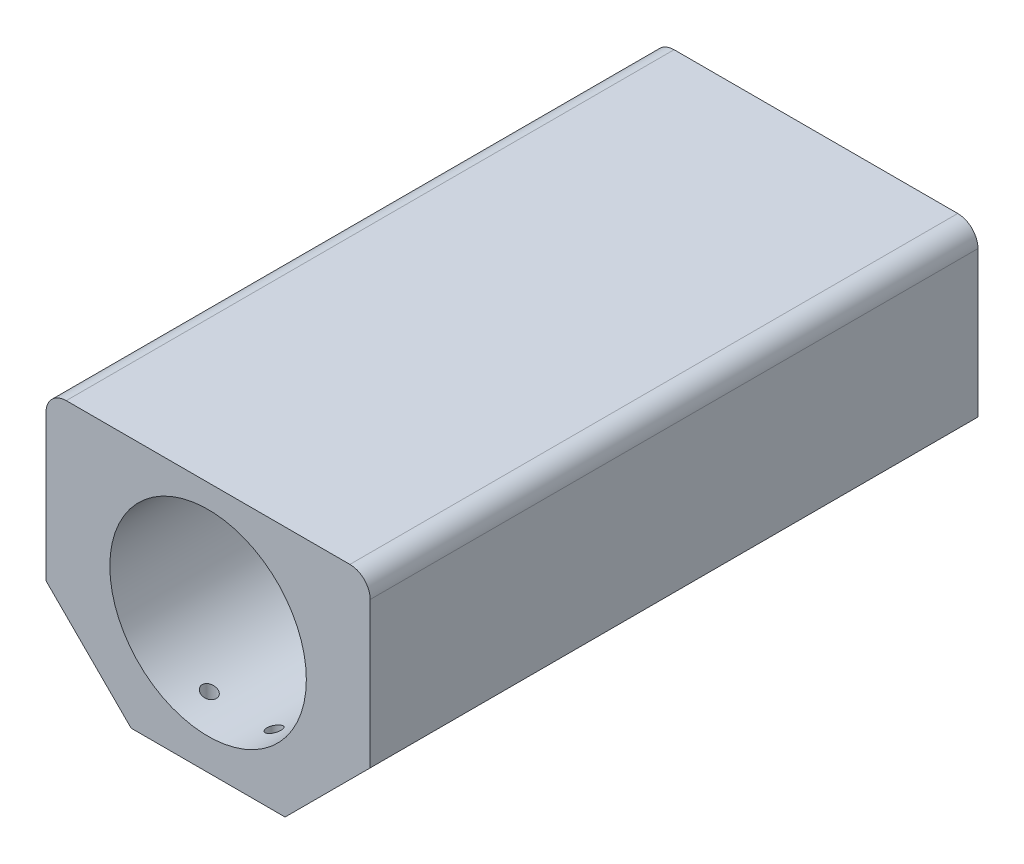
ISO-10303-21;
HEADER;
FILE_DESCRIPTION(('STEP AP214'),'2;1');
FILE_NAME('part.step','',(''),(''),'','','');
FILE_SCHEMA(('AUTOMOTIVE_DESIGN { 1 0 10303 214 1 1 1 1 }'));
ENDSEC;
DATA;
#1=APPLICATION_CONTEXT('core data for automotive mechanical design processes');
#2=APPLICATION_PROTOCOL_DEFINITION('international standard','automotive_design',2000,#1);
#3=PRODUCT_CONTEXT('',#1,'mechanical');
#4=PRODUCT('Part','Part','',(#3));
#5=PRODUCT_RELATED_PRODUCT_CATEGORY('part','',(#4));
#6=PRODUCT_DEFINITION_FORMATION('','',#4);
#7=PRODUCT_DEFINITION_CONTEXT('part definition',#1,'design');
#8=PRODUCT_DEFINITION('design','',#6,#7);
#9=PRODUCT_DEFINITION_SHAPE('','',#8);
#10=(LENGTH_UNIT() NAMED_UNIT(*) SI_UNIT(.MILLI.,.METRE.));
#11=(NAMED_UNIT(*) PLANE_ANGLE_UNIT() SI_UNIT($,.RADIAN.));
#12=(NAMED_UNIT(*) SI_UNIT($,.STERADIAN.) SOLID_ANGLE_UNIT());
#13=UNCERTAINTY_MEASURE_WITH_UNIT(LENGTH_MEASURE(1.E-05),#10,'distance_accuracy_value','');
#14=(GEOMETRIC_REPRESENTATION_CONTEXT(3) GLOBAL_UNCERTAINTY_ASSIGNED_CONTEXT((#13)) GLOBAL_UNIT_ASSIGNED_CONTEXT((#10,
#11,#12)) REPRESENTATION_CONTEXT('',''));
#15=CARTESIAN_POINT('',(0.,0.,0.));
#16=DIRECTION('',(0.,0.,1.));
#17=DIRECTION('',(1.,0.,0.));
#18=AXIS2_PLACEMENT_3D('',#15,#16,#17);
#19=CARTESIAN_POINT('',(0.,0.,150.));
#20=DIRECTION('',(0.,0.,1.));
#21=DIRECTION('',(1.,0.,0.));
#22=AXIS2_PLACEMENT_3D('',#19,#20,#21);
#23=PLANE('',#22);
#24=DIRECTION('',(0.,1.,0.));
#25=VECTOR('',#24,1.);
#26=CARTESIAN_POINT('',(40.,30.,150.));
#27=LINE('',#26,#25);
#28=CARTESIAN_POINT('',(40.,-11.,150.));
#29=VERTEX_POINT('',#28);
#30=CARTESIAN_POINT('',(40.,25.,150.));
#31=VERTEX_POINT('',#30);
#32=EDGE_CURVE('E181',#29,#31,#27,.T.);
#33=ORIENTED_EDGE('',*,*,#32,.T.);
#34=CARTESIAN_POINT('',(35.,25.,150.));
#35=DIRECTION('',(0.,0.,1.));
#36=DIRECTION('',(1.,0.,0.));
#37=AXIS2_PLACEMENT_3D('',#34,#35,#36);
#38=CIRCLE('',#37,5.);
#39=CARTESIAN_POINT('',(35.,30.,150.));
#40=VERTEX_POINT('',#39);
#41=EDGE_CURVE('E53',#31,#40,#38,.T.);
#42=ORIENTED_EDGE('',*,*,#41,.T.);
#43=DIRECTION('',(-1.,0.,0.));
#44=VECTOR('',#43,1.);
#45=CARTESIAN_POINT('',(-40.,30.,150.));
#46=LINE('',#45,#44);
#47=CARTESIAN_POINT('',(-35.,30.,150.));
#48=VERTEX_POINT('',#47);
#49=EDGE_CURVE('E185',#40,#48,#46,.T.);
#50=ORIENTED_EDGE('',*,*,#49,.T.);
#51=CARTESIAN_POINT('',(-35.,25.,150.));
#52=DIRECTION('',(0.,0.,1.));
#53=DIRECTION('',(1.,0.,0.));
#54=AXIS2_PLACEMENT_3D('',#51,#52,#53);
#55=CIRCLE('',#54,5.);
#56=CARTESIAN_POINT('',(-40.,25.,150.));
#57=VERTEX_POINT('',#56);
#58=EDGE_CURVE('E60',#48,#57,#55,.T.);
#59=ORIENTED_EDGE('',*,*,#58,.T.);
#60=DIRECTION('',(0.,-1.,0.));
#61=VECTOR('',#60,1.);
#62=CARTESIAN_POINT('',(-40.,30.,150.));
#63=LINE('',#62,#61);
#64=CARTESIAN_POINT('',(-40.,-11.,150.));
#65=VERTEX_POINT('',#64);
#66=EDGE_CURVE('E178',#57,#65,#63,.T.);
#67=ORIENTED_EDGE('',*,*,#66,.T.);
#68=DIRECTION('',(-0.707106781186548,0.707106781186548,0.));
#69=VECTOR('',#68,1.);
#70=CARTESIAN_POINT('',(-19.,-32.,150.));
#71=LINE('',#70,#69);
#72=CARTESIAN_POINT('',(-19.,-32.,150.));
#73=VERTEX_POINT('',#72);
#74=EDGE_CURVE('E130',#73,#65,#71,.T.);
#75=ORIENTED_EDGE('',*,*,#74,.F.);
#76=DIRECTION('',(-1.,0.,0.));
#77=VECTOR('',#76,1.);
#78=CARTESIAN_POINT('',(-40.,-32.,150.));
#79=LINE('',#78,#77);
#80=CARTESIAN_POINT('',(19.,-32.,150.));
#81=VERTEX_POINT('',#80);
#82=EDGE_CURVE('E167',#81,#73,#79,.T.);
#83=ORIENTED_EDGE('',*,*,#82,.F.);
#84=DIRECTION('',(-0.707106781186548,-0.707106781186548,0.));
#85=VECTOR('',#84,1.);
#86=CARTESIAN_POINT('',(19.,-32.,150.));
#87=LINE('',#86,#85);
#88=EDGE_CURVE('E144',#29,#81,#87,.T.);
#89=ORIENTED_EDGE('',*,*,#88,.F.);
#90=EDGE_LOOP('',(#33,#42,#50,#59,#67,#75,#83,#89));
#91=FACE_BOUND('',#90,.T.);
#92=CARTESIAN_POINT('',(0.,0.,150.));
#93=DIRECTION('',(0.,0.,1.));
#94=DIRECTION('',(1.,0.,0.));
#95=AXIS2_PLACEMENT_3D('',#92,#93,#94);
#96=CIRCLE('',#95,24.25);
#97=CARTESIAN_POINT('',(24.25,0.,150.));
#98=VERTEX_POINT('',#97);
#99=EDGE_CURVE('E122',#98,#98,#96,.T.);
#100=ORIENTED_EDGE('',*,*,#99,.F.);
#101=EDGE_LOOP('',(#100));
#102=FACE_BOUND('',#101,.T.);
#103=ADVANCED_FACE('F44',(#91,#102),#23,.T.);
#104=CARTESIAN_POINT('',(0.,0.,0.));
#105=DIRECTION('',(0.,0.,1.));
#106=DIRECTION('',(1.,0.,0.));
#107=AXIS2_PLACEMENT_3D('',#104,#105,#106);
#108=PLANE('',#107);
#109=DIRECTION('',(-1.,0.,0.));
#110=VECTOR('',#109,1.);
#111=CARTESIAN_POINT('',(-40.,30.,0.));
#112=LINE('',#111,#110);
#113=CARTESIAN_POINT('',(35.,30.,0.));
#114=VERTEX_POINT('',#113);
#115=CARTESIAN_POINT('',(-35.,30.,0.));
#116=VERTEX_POINT('',#115);
#117=EDGE_CURVE('E182',#114,#116,#112,.T.);
#118=ORIENTED_EDGE('',*,*,#117,.F.);
#119=CARTESIAN_POINT('',(35.,25.,0.));
#120=DIRECTION('',(0.,0.,1.));
#121=DIRECTION('',(1.,0.,0.));
#122=AXIS2_PLACEMENT_3D('',#119,#120,#121);
#123=CIRCLE('',#122,5.);
#124=CARTESIAN_POINT('',(40.,25.,0.));
#125=VERTEX_POINT('',#124);
#126=EDGE_CURVE('E211',#114,#125,#123,.F.);
#127=ORIENTED_EDGE('',*,*,#126,.T.);
#128=DIRECTION('',(0.,1.,0.));
#129=VECTOR('',#128,1.);
#130=CARTESIAN_POINT('',(40.,30.,0.));
#131=LINE('',#130,#129);
#132=CARTESIAN_POINT('',(40.,-11.,0.));
#133=VERTEX_POINT('',#132);
#134=EDGE_CURVE('E121',#133,#125,#131,.T.);
#135=ORIENTED_EDGE('',*,*,#134,.F.);
#136=DIRECTION('',(-0.707106781186548,-0.707106781186548,0.));
#137=VECTOR('',#136,1.);
#138=CARTESIAN_POINT('',(19.,-32.,0.));
#139=LINE('',#138,#137);
#140=CARTESIAN_POINT('',(19.,-32.,0.));
#141=VERTEX_POINT('',#140);
#142=EDGE_CURVE('E155',#133,#141,#139,.T.);
#143=ORIENTED_EDGE('',*,*,#142,.T.);
#144=DIRECTION('',(1.,0.,0.));
#145=VECTOR('',#144,1.);
#146=CARTESIAN_POINT('',(-40.,-32.,0.));
#147=LINE('',#146,#145);
#148=CARTESIAN_POINT('',(-19.,-32.,0.));
#149=VERTEX_POINT('',#148);
#150=EDGE_CURVE('E140',#149,#141,#147,.T.);
#151=ORIENTED_EDGE('',*,*,#150,.F.);
#152=DIRECTION('',(-0.707106781186548,0.707106781186548,0.));
#153=VECTOR('',#152,1.);
#154=CARTESIAN_POINT('',(-19.,-32.,0.));
#155=LINE('',#154,#153);
#156=CARTESIAN_POINT('',(-40.,-11.,0.));
#157=VERTEX_POINT('',#156);
#158=EDGE_CURVE('E127',#149,#157,#155,.T.);
#159=ORIENTED_EDGE('',*,*,#158,.T.);
#160=DIRECTION('',(0.,-1.,0.));
#161=VECTOR('',#160,1.);
#162=CARTESIAN_POINT('',(-40.,30.,0.));
#163=LINE('',#162,#161);
#164=CARTESIAN_POINT('',(-40.,25.,0.));
#165=VERTEX_POINT('',#164);
#166=EDGE_CURVE('E113',#165,#157,#163,.T.);
#167=ORIENTED_EDGE('',*,*,#166,.F.);
#168=CARTESIAN_POINT('',(-35.,25.,0.));
#169=DIRECTION('',(0.,0.,1.));
#170=DIRECTION('',(1.,0.,0.));
#171=AXIS2_PLACEMENT_3D('',#168,#169,#170);
#172=CIRCLE('',#171,5.);
#173=EDGE_CURVE('E208',#165,#116,#172,.F.);
#174=ORIENTED_EDGE('',*,*,#173,.T.);
#175=EDGE_LOOP('',(#118,#127,#135,#143,#151,#159,#167,#174));
#176=FACE_BOUND('',#175,.T.);
#177=CARTESIAN_POINT('',(0.,0.,0.));
#178=DIRECTION('',(0.,0.,1.));
#179=DIRECTION('',(1.,0.,0.));
#180=AXIS2_PLACEMENT_3D('',#177,#178,#179);
#181=CIRCLE('',#180,24.25);
#182=CARTESIAN_POINT('',(24.25,0.,0.));
#183=VERTEX_POINT('',#182);
#184=EDGE_CURVE('E171',#183,#183,#181,.T.);
#185=ORIENTED_EDGE('',*,*,#184,.T.);
#186=EDGE_LOOP('',(#185));
#187=FACE_BOUND('',#186,.T.);
#188=ADVANCED_FACE('F136',(#176,#187),#108,.F.);
#189=CARTESIAN_POINT('',(-40.,30.,150.));
#190=DIRECTION('',(1.,0.,0.));
#191=DIRECTION('',(0.,1.,0.));
#192=AXIS2_PLACEMENT_3D('',#189,#190,#191);
#193=PLANE('',#192);
#194=ORIENTED_EDGE('',*,*,#66,.F.);
#195=DIRECTION('',(0.,0.,-1.));
#196=VECTOR('',#195,1.);
#197=CARTESIAN_POINT('',(-40.,25.,150.));
#198=LINE('',#197,#196);
#199=EDGE_CURVE('E11',#57,#165,#198,.T.);
#200=ORIENTED_EDGE('',*,*,#199,.T.);
#201=ORIENTED_EDGE('',*,*,#166,.T.);
#202=DIRECTION('',(0.,0.,1.));
#203=VECTOR('',#202,1.);
#204=CARTESIAN_POINT('',(-40.,-11.,0.));
#205=LINE('',#204,#203);
#206=EDGE_CURVE('E116',#157,#65,#205,.T.);
#207=ORIENTED_EDGE('',*,*,#206,.T.);
#208=EDGE_LOOP('',(#194,#200,#201,#207));
#209=FACE_BOUND('',#208,.T.);
#210=ADVANCED_FACE('F115',(#209),#193,.F.);
#211=CARTESIAN_POINT('',(40.,30.,150.));
#212=DIRECTION('',(-1.,0.,0.));
#213=DIRECTION('',(0.,-1.,0.));
#214=AXIS2_PLACEMENT_3D('',#211,#212,#213);
#215=PLANE('',#214);
#216=ORIENTED_EDGE('',*,*,#134,.T.);
#217=DIRECTION('',(0.,0.,-1.));
#218=VECTOR('',#217,1.);
#219=CARTESIAN_POINT('',(40.,25.,150.));
#220=LINE('',#219,#218);
#221=EDGE_CURVE('E68',#125,#31,#220,.F.);
#222=ORIENTED_EDGE('',*,*,#221,.T.);
#223=ORIENTED_EDGE('',*,*,#32,.F.);
#224=DIRECTION('',(0.,0.,1.));
#225=VECTOR('',#224,1.);
#226=CARTESIAN_POINT('',(40.,-11.,0.));
#227=LINE('',#226,#225);
#228=EDGE_CURVE('E152',#133,#29,#227,.T.);
#229=ORIENTED_EDGE('',*,*,#228,.F.);
#230=EDGE_LOOP('',(#216,#222,#223,#229));
#231=FACE_BOUND('',#230,.T.);
#232=ADVANCED_FACE('F230',(#231),#215,.F.);
#233=CARTESIAN_POINT('',(-40.,30.,150.));
#234=DIRECTION('',(0.,-1.,0.));
#235=DIRECTION('',(0.,0.,-1.));
#236=AXIS2_PLACEMENT_3D('',#233,#234,#235);
#237=PLANE('',#236);
#238=ORIENTED_EDGE('',*,*,#49,.F.);
#239=DIRECTION('',(0.,0.,-1.));
#240=VECTOR('',#239,1.);
#241=CARTESIAN_POINT('',(35.,30.,150.));
#242=LINE('',#241,#240);
#243=EDGE_CURVE('E204',#40,#114,#242,.T.);
#244=ORIENTED_EDGE('',*,*,#243,.T.);
#245=ORIENTED_EDGE('',*,*,#117,.T.);
#246=DIRECTION('',(0.,0.,-1.));
#247=VECTOR('',#246,1.);
#248=CARTESIAN_POINT('',(-35.,30.,150.));
#249=LINE('',#248,#247);
#250=EDGE_CURVE('E187',#116,#48,#249,.F.);
#251=ORIENTED_EDGE('',*,*,#250,.T.);
#252=EDGE_LOOP('',(#238,#244,#245,#251));
#253=FACE_BOUND('',#252,.T.);
#254=ADVANCED_FACE('F225',(#253),#237,.F.);
#255=CARTESIAN_POINT('',(0.,0.,150.));
#256=DIRECTION('',(0.,0.,-1.));
#257=DIRECTION('',(-1.,0.,0.));
#258=AXIS2_PLACEMENT_3D('',#255,#256,#257);
#259=CYLINDRICAL_SURFACE('',#258,24.25);
#260=CARTESIAN_POINT('',(8.,-22.8924114064028,139.95));
#261=CARTESIAN_POINT('',(8.10433357294266,-22.8559497122039,139.950004048093));
#262=CARTESIAN_POINT('',(8.20849993349457,-22.8187398305708,139.959354290502));
#263=CARTESIAN_POINT('',(8.41351732450677,-22.7439482200212,139.996361371671));
#264=CARTESIAN_POINT('',(8.51436302836285,-22.7063660085517,140.024046249468));
#265=CARTESIAN_POINT('',(8.70983515775985,-22.6321054792018,140.097030329321));
#266=CARTESIAN_POINT('',(8.80446215833636,-22.5954270779438,140.142327900068));
#267=CARTESIAN_POINT('',(8.98471937423794,-22.5243581653017,140.249544867665));
#268=CARTESIAN_POINT('',(9.07035255715664,-22.4899669006382,140.311458757682));
#269=CARTESIAN_POINT('',(9.22855320810483,-22.425509824604,140.449405884656));
#270=CARTESIAN_POINT('',(9.30131472320015,-22.3953814530132,140.525186486511));
#271=CARTESIAN_POINT('',(9.43280615585198,-22.3403169867193,140.689731586142));
#272=CARTESIAN_POINT('',(9.49154153184669,-22.315378872653,140.778491011303));
#273=CARTESIAN_POINT('',(9.58901798093833,-22.273658572767,140.960122663761));
#274=CARTESIAN_POINT('',(9.628841197012,-22.2564394302658,141.052312679209));
#275=CARTESIAN_POINT('',(9.69227702253616,-22.2288883845031,141.24307255001));
#276=CARTESIAN_POINT('',(9.7158995902009,-22.2185522505077,141.341638445384));
#277=CARTESIAN_POINT('',(9.74460463460175,-22.2059767556492,141.533983630406));
#278=CARTESIAN_POINT('',(9.75099590925239,-22.2031659420011,141.627532023388));
#279=CARTESIAN_POINT('',(9.74875287045322,-22.2041509954665,141.814402231091));
#280=CARTESIAN_POINT('',(9.74012206573596,-22.2079453198068,141.907724093625));
#281=CARTESIAN_POINT('',(9.7087719824154,-22.2216677928656,142.088211578555));
#282=CARTESIAN_POINT('',(9.68653817866442,-22.2313845342951,142.175478673073));
#283=CARTESIAN_POINT('',(9.62929939834872,-22.2562364260639,142.344887857779));
#284=CARTESIAN_POINT('',(9.59429313091912,-22.2713721240738,142.427029428968));
#285=CARTESIAN_POINT('',(9.51147832140637,-22.3068680671744,142.586721289069));
#286=CARTESIAN_POINT('',(9.46330479116525,-22.3273764367789,142.664048705176));
#287=CARTESIAN_POINT('',(9.3562783264209,-22.372436664399,142.80958362651));
#288=CARTESIAN_POINT('',(9.29742225926787,-22.3969897083181,142.877788446323));
#289=CARTESIAN_POINT('',(9.16609347587616,-22.4510716723443,143.008399752805));
#290=CARTESIAN_POINT('',(9.09294348937171,-22.4808321263877,143.070029129118));
#291=CARTESIAN_POINT('',(8.93830875520039,-22.5427610497888,143.180236529411));
#292=CARTESIAN_POINT('',(8.85682110687321,-22.5749303561317,143.228809989795));
#293=CARTESIAN_POINT('',(8.68144265964171,-22.6429791956146,143.315039532173));
#294=CARTESIAN_POINT('',(8.58708142256231,-22.6789593079087,143.351661838128));
#295=CARTESIAN_POINT('',(8.39358986213065,-22.7512817515768,143.40814229808));
#296=CARTESIAN_POINT('',(8.29445840451636,-22.7876241674543,143.427996443919));
#297=CARTESIAN_POINT('',(8.09047476022871,-22.8608585914563,143.450773252195));
#298=CARTESIAN_POINT('',(7.98554375893454,-22.8977253570515,143.453079370013));
#299=CARTESIAN_POINT('',(7.77632254618258,-22.9696221853958,143.438810139078));
#300=CARTESIAN_POINT('',(7.67203232320481,-23.0046522812506,143.422235130777));
#301=CARTESIAN_POINT('',(7.46857736683953,-23.0715014203267,143.370617668233));
#302=CARTESIAN_POINT('',(7.36936451301181,-23.1033554513875,143.335811265341));
#303=CARTESIAN_POINT('',(7.17791407419914,-23.163551574133,143.24846267085));
#304=CARTESIAN_POINT('',(7.08567483337141,-23.1918945005355,143.195924705796));
#305=CARTESIAN_POINT('',(6.91516497913742,-23.2432914893696,143.076944743072));
#306=CARTESIAN_POINT('',(6.8364661898956,-23.2665196591641,143.011191920608));
#307=CARTESIAN_POINT('',(6.69123000415486,-23.3087037508261,142.866249076813));
#308=CARTESIAN_POINT('',(6.62468926782362,-23.3276608462976,142.787062757241));
#309=CARTESIAN_POINT('',(6.50897210658454,-23.3602063724668,142.62145037331));
#310=CARTESIAN_POINT('',(6.45913879476651,-23.3740013031914,142.535523512995));
#311=CARTESIAN_POINT('',(6.3745718217497,-23.3972064193831,142.355989659054));
#312=CARTESIAN_POINT('',(6.33983510268192,-23.406617492844,142.262384225319));
#313=CARTESIAN_POINT('',(6.28759106581895,-23.4207047544165,142.07343410652));
#314=CARTESIAN_POINT('',(6.26956174003469,-23.4255245397077,141.97824416184));
#315=CARTESIAN_POINT('',(6.24945148047597,-23.4308977309396,141.786078554489));
#316=CARTESIAN_POINT('',(6.24736884711717,-23.4314515915388,141.689103083222));
#317=CARTESIAN_POINT('',(6.2591344726144,-23.4283112634582,141.497629715897));
#318=CARTESIAN_POINT('',(6.2727494580359,-23.4246792785847,141.403116344152));
#319=CARTESIAN_POINT('',(6.31506421379912,-23.4133068755972,141.217791580483));
#320=CARTESIAN_POINT('',(6.34376371705879,-23.4055665302246,141.126980123044));
#321=CARTESIAN_POINT('',(6.41537068477952,-23.386040508657,140.951357957307));
#322=CARTESIAN_POINT('',(6.45831241646701,-23.3742450732684,140.866562326472));
#323=CARTESIAN_POINT('',(6.55696917863561,-23.3467613908113,140.705472672892));
#324=CARTESIAN_POINT('',(6.61268443549079,-23.3310730747522,140.629178800852));
#325=CARTESIAN_POINT('',(6.73628037004879,-23.2956911239622,140.48564822403));
#326=CARTESIAN_POINT('',(6.80437067839834,-23.2759275262963,140.418609485445));
#327=CARTESIAN_POINT('',(6.94987144511878,-23.2328976964795,140.296884682322));
#328=CARTESIAN_POINT('',(7.02728547294057,-23.2096301220229,140.242203371837));
#329=CARTESIAN_POINT('',(7.19199162752182,-23.1591327164015,140.144652575419));
#330=CARTESIAN_POINT('',(7.27953548186719,-23.1317922760151,140.102266397341));
#331=CARTESIAN_POINT('',(7.45954691098953,-23.0743701946236,140.032754765941));
#332=CARTESIAN_POINT('',(7.55200987980757,-23.0442910997834,140.005615302541));
#333=CARTESIAN_POINT('',(7.70414403384928,-22.9937487830554,139.974154520944));
#334=CARTESIAN_POINT('',(7.76308981270969,-22.9739164632307,139.965091566035));
#335=CARTESIAN_POINT('',(7.88137505735382,-22.9336070915143,139.953013149579));
#336=CARTESIAN_POINT('',(7.94071452390019,-22.9131300383735,139.949997699752));
#337=CARTESIAN_POINT('',(8.,-22.8924114064028,139.95));
#338=B_SPLINE_CURVE_WITH_KNOTS('',3,(#260,#261,#262,#263,#264,#265,#266,#267,#268,#269,#270,
#271,#272,#273,#274,#275,#276,#277,#278,#279,#280,#281,#282,#283,#284,#285,#286,#287,#288,#289,
#290,#291,#292,#293,#294,#295,#296,#297,#298,#299,#300,#301,#302,#303,#304,#305,#306,#307,#308,
#309,#310,#311,#312,#313,#314,#315,#316,#317,#318,#319,#320,#321,#322,#323,#324,#325,#326,#327,
#328,#329,#330,#331,#332,#333,#334,#335,#336,#337),.UNSPECIFIED.,.T.,.F.,(4,2,2,2,2,2,2,2,2,2,2,
2,2,2,2,2,2,2,2,2,2,2,2,2,2,2,2,2,2,2,2,2,2,2,2,2,2,2,4),(0.,0.331334293633508,
0.663176468312504,0.994987914665915,1.3266895304967,1.65286044233522,1.97890421328514,
2.28293623024731,2.58678119691185,2.86679545425703,3.14674431697388,3.41724189387494,
3.6877668165254,3.96672278488561,4.24576068953297,4.54499733760949,4.84433844594958,
5.16516388736204,5.48606599521786,5.81819304489709,6.15031410598501,6.47823760263791,
6.80608298966562,7.11993506444173,7.43370079361456,7.73306317872175,8.03236489861098,
8.32196443477272,8.61153310524284,8.89685352146315,9.182168886054,9.4681757691084,
9.75418772120579,10.0455941060896,10.337112408432,10.6388880467573,10.9403859304835,
11.1286596829122,11.3169338001712),.UNSPECIFIED.);
#339=CARTESIAN_POINT('',(8.,-22.8924114064028,139.95));
#340=VERTEX_POINT('',#339);
#341=EDGE_CURVE('E288',#340,#340,#338,.T.);
#342=ORIENTED_EDGE('',*,*,#341,.T.);
#343=EDGE_LOOP('',(#342));
#344=FACE_BOUND('',#343,.T.);
#345=CARTESIAN_POINT('',(8.,-22.8924114064028,109.95));
#346=CARTESIAN_POINT('',(8.10433357294266,-22.8559497122039,109.950004048093));
#347=CARTESIAN_POINT('',(8.20849993349457,-22.8187398305708,109.959354290502));
#348=CARTESIAN_POINT('',(8.41351732450677,-22.7439482200212,109.996361371671));
#349=CARTESIAN_POINT('',(8.51436302836285,-22.7063660085517,110.024046249468));
#350=CARTESIAN_POINT('',(8.70983515775985,-22.6321054792018,110.097030329321));
#351=CARTESIAN_POINT('',(8.80446215833636,-22.5954270779438,110.142327900068));
#352=CARTESIAN_POINT('',(8.98471937423793,-22.5243581653017,110.249544867665));
#353=CARTESIAN_POINT('',(9.07035255715662,-22.4899669006382,110.311458757682));
#354=CARTESIAN_POINT('',(9.22855320810482,-22.425509824604,110.449405884656));
#355=CARTESIAN_POINT('',(9.30131472320016,-22.3953814530132,110.525186486511));
#356=CARTESIAN_POINT('',(9.43280615585199,-22.3403169867193,110.689731586142));
#357=CARTESIAN_POINT('',(9.49154153184669,-22.315378872653,110.778491011303));
#358=CARTESIAN_POINT('',(9.58901798093832,-22.273658572767,110.960122663761));
#359=CARTESIAN_POINT('',(9.628841197012,-22.2564394302658,111.052312679209));
#360=CARTESIAN_POINT('',(9.69227702253617,-22.2288883845031,111.24307255001));
#361=CARTESIAN_POINT('',(9.7158995902009,-22.2185522505077,111.341638445384));
#362=CARTESIAN_POINT('',(9.74460463460175,-22.2059767556492,111.533983630406));
#363=CARTESIAN_POINT('',(9.75099590925239,-22.2031659420011,111.627532023388));
#364=CARTESIAN_POINT('',(9.74875287045322,-22.2041509954665,111.814402231091));
#365=CARTESIAN_POINT('',(9.74012206573597,-22.2079453198068,111.907724093625));
#366=CARTESIAN_POINT('',(9.7087719824154,-22.2216677928656,112.088211578555));
#367=CARTESIAN_POINT('',(9.68653817866441,-22.2313845342951,112.175478673073));
#368=CARTESIAN_POINT('',(9.62929939834872,-22.2562364260639,112.344887857779));
#369=CARTESIAN_POINT('',(9.59429313091912,-22.2713721240738,112.427029428968));
#370=CARTESIAN_POINT('',(9.51147832140638,-22.3068680671744,112.586721289069));
#371=CARTESIAN_POINT('',(9.46330479116526,-22.3273764367789,112.664048705176));
#372=CARTESIAN_POINT('',(9.3562783264209,-22.372436664399,112.80958362651));
#373=CARTESIAN_POINT('',(9.29742225926788,-22.3969897083181,112.877788446323));
#374=CARTESIAN_POINT('',(9.16609347587616,-22.4510716723443,113.008399752805));
#375=CARTESIAN_POINT('',(9.09294348937171,-22.4808321263877,113.070029129118));
#376=CARTESIAN_POINT('',(8.93830875520039,-22.5427610497888,113.180236529411));
#377=CARTESIAN_POINT('',(8.85682110687322,-22.5749303561317,113.228809989795));
#378=CARTESIAN_POINT('',(8.68144265964172,-22.6429791956146,113.315039532173));
#379=CARTESIAN_POINT('',(8.58708142256232,-22.6789593079087,113.351661838128));
#380=CARTESIAN_POINT('',(8.39358986213067,-22.7512817515768,113.40814229808));
#381=CARTESIAN_POINT('',(8.29445840451637,-22.7876241674543,113.427996443919));
#382=CARTESIAN_POINT('',(8.09047476022873,-22.8608585914563,113.450773252195));
#383=CARTESIAN_POINT('',(7.98554375893455,-22.8977253570515,113.453079370013));
#384=CARTESIAN_POINT('',(7.77632254618259,-22.9696221853958,113.438810139078));
#385=CARTESIAN_POINT('',(7.67203232320481,-23.0046522812506,113.422235130777));
#386=CARTESIAN_POINT('',(7.46857736683954,-23.0715014203267,113.370617668233));
#387=CARTESIAN_POINT('',(7.36936451301182,-23.1033554513875,113.335811265341));
#388=CARTESIAN_POINT('',(7.17791407419915,-23.163551574133,113.24846267085));
#389=CARTESIAN_POINT('',(7.08567483337142,-23.1918945005355,113.195924705796));
#390=CARTESIAN_POINT('',(6.91516497913743,-23.2432914893696,113.076944743072));
#391=CARTESIAN_POINT('',(6.83646618989562,-23.2665196591641,113.011191920608));
#392=CARTESIAN_POINT('',(6.69123000415487,-23.3087037508261,112.866249076813));
#393=CARTESIAN_POINT('',(6.62468926782363,-23.3276608462976,112.787062757242));
#394=CARTESIAN_POINT('',(6.50897210658455,-23.3602063724668,112.62145037331));
#395=CARTESIAN_POINT('',(6.45913879476652,-23.3740013031914,112.535523512995));
#396=CARTESIAN_POINT('',(6.37457182174971,-23.3972064193831,112.355989659054));
#397=CARTESIAN_POINT('',(6.33983510268192,-23.406617492844,112.262384225319));
#398=CARTESIAN_POINT('',(6.28759106581895,-23.4207047544165,112.07343410652));
#399=CARTESIAN_POINT('',(6.26956174003469,-23.4255245397077,111.97824416184));
#400=CARTESIAN_POINT('',(6.24945148047597,-23.4308977309396,111.786078554489));
#401=CARTESIAN_POINT('',(6.24736884711717,-23.4314515915388,111.689103083222));
#402=CARTESIAN_POINT('',(6.2591344726144,-23.4283112634582,111.497629715897));
#403=CARTESIAN_POINT('',(6.27274945803589,-23.4246792785847,111.403116344152));
#404=CARTESIAN_POINT('',(6.31506421379911,-23.4133068755972,111.217791580483));
#405=CARTESIAN_POINT('',(6.34376371705879,-23.4055665302246,111.126980123044));
#406=CARTESIAN_POINT('',(6.41537068477952,-23.386040508657,110.951357957307));
#407=CARTESIAN_POINT('',(6.458312416467,-23.3742450732684,110.866562326472));
#408=CARTESIAN_POINT('',(6.55696917863559,-23.3467613908113,110.705472672892));
#409=CARTESIAN_POINT('',(6.61268443549078,-23.3310730747522,110.629178800852));
#410=CARTESIAN_POINT('',(6.73628037004879,-23.2956911239622,110.48564822403));
#411=CARTESIAN_POINT('',(6.80437067839833,-23.2759275262963,110.418609485445));
#412=CARTESIAN_POINT('',(6.94987144511878,-23.2328976964795,110.296884682322));
#413=CARTESIAN_POINT('',(7.02728547294057,-23.2096301220229,110.242203371837));
#414=CARTESIAN_POINT('',(7.19199162752183,-23.1591327164015,110.144652575419));
#415=CARTESIAN_POINT('',(7.2795354818672,-23.1317922760151,110.102266397341));
#416=CARTESIAN_POINT('',(7.45954691098953,-23.0743701946236,110.032754765941));
#417=CARTESIAN_POINT('',(7.55200987980756,-23.0442910997834,110.005615302541));
#418=CARTESIAN_POINT('',(7.70414403384927,-22.9937487830554,109.974154520944));
#419=CARTESIAN_POINT('',(7.76308981270968,-22.9739164632307,109.965091566035));
#420=CARTESIAN_POINT('',(7.88137505735381,-22.9336070915143,109.953013149579));
#421=CARTESIAN_POINT('',(7.94071452390019,-22.9131300383735,109.949997699752));
#422=CARTESIAN_POINT('',(8.,-22.8924114064028,109.95));
#423=B_SPLINE_CURVE_WITH_KNOTS('',3,(#345,#346,#347,#348,#349,#350,#351,#352,#353,#354,#355,
#356,#357,#358,#359,#360,#361,#362,#363,#364,#365,#366,#367,#368,#369,#370,#371,#372,#373,#374,
#375,#376,#377,#378,#379,#380,#381,#382,#383,#384,#385,#386,#387,#388,#389,#390,#391,#392,#393,
#394,#395,#396,#397,#398,#399,#400,#401,#402,#403,#404,#405,#406,#407,#408,#409,#410,#411,#412,
#413,#414,#415,#416,#417,#418,#419,#420,#421,#422),.UNSPECIFIED.,.T.,.F.,(4,2,2,2,2,2,2,2,2,2,2,
2,2,2,2,2,2,2,2,2,2,2,2,2,2,2,2,2,2,2,2,2,2,2,2,2,2,2,4),(0.,0.331334293633509,
0.663176468312498,0.994987914665911,1.32668953049668,1.65286044233523,1.97890421328515,
2.2829362302473,2.58678119691185,2.86679545425701,3.14674431697388,3.41724189387492,
3.68776681652539,3.96672278488558,4.24576068953296,4.54499733760948,4.84433844594957,
5.16516388736202,5.48606599521785,5.81819304489708,6.150314105985,6.4782376026379,
6.80608298966561,7.11993506444172,7.43370079361454,7.73306317872173,8.03236489861098,
8.32196443477273,8.61153310524282,8.89685352146313,9.18216888605399,9.46817576910838,
9.75418772120579,10.0455941060896,10.337112408432,10.6388880467573,10.9403859304835,
11.1286596829122,11.3169338001712),.UNSPECIFIED.);
#424=CARTESIAN_POINT('',(8.,-22.8924114064028,109.95));
#425=VERTEX_POINT('',#424);
#426=EDGE_CURVE('E468',#425,#425,#423,.T.);
#427=ORIENTED_EDGE('',*,*,#426,.T.);
#428=EDGE_LOOP('',(#427));
#429=FACE_BOUND('',#428,.T.);
#430=CARTESIAN_POINT('',(-8.,-22.8924114064028,109.95));
#431=CARTESIAN_POINT('',(-7.89904468974055,-22.9276903647347,109.95000358086));
#432=CARTESIAN_POINT('',(-7.79779105789885,-22.9623186125341,109.958756030023));
#433=CARTESIAN_POINT('',(-7.59753319621065,-23.0293544506875,109.99387290465));
#434=CARTESIAN_POINT('',(-7.49853115126179,-23.0617599408378,110.020253740508));
#435=CARTESIAN_POINT('',(-7.30566547830961,-23.1235814801303,110.090361164229));
#436=CARTESIAN_POINT('',(-7.21180946860057,-23.152993149504,110.134112718838));
#437=CARTESIAN_POINT('',(-7.032510045011,-23.2080827826809,110.23808510236));
#438=CARTESIAN_POINT('',(-6.94706361230767,-23.2337620878972,110.298299991814));
#439=CARTESIAN_POINT('',(-6.79048044672971,-23.2799981445086,110.431249252657));
#440=CARTESIAN_POINT('',(-6.71893863659251,-23.3007062950454,110.503453505208));
#441=CARTESIAN_POINT('',(-6.5890141782852,-23.3377798713555,110.659834185156));
#442=CARTESIAN_POINT('',(-6.53062869045337,-23.354146234396,110.744008022626));
#443=CARTESIAN_POINT('',(-6.43138124857051,-23.3816676817597,110.917994428629));
#444=CARTESIAN_POINT('',(-6.38987266069307,-23.393016917234,111.00740778427));
#445=CARTESIAN_POINT('',(-6.32236699832597,-23.4113521402389,111.19232893542));
#446=CARTESIAN_POINT('',(-6.29636711985784,-23.4183389165139,111.287835625796));
#447=CARTESIAN_POINT('',(-6.26131063985513,-23.4277359396114,111.479372993317));
#448=CARTESIAN_POINT('',(-6.25180375947084,-23.4302678385019,111.575315536938));
#449=CARTESIAN_POINT('',(-6.24866383512068,-23.4311054868388,111.767474814741));
#450=CARTESIAN_POINT('',(-6.25502944897698,-23.4294115936182,111.86369152505));
#451=CARTESIAN_POINT('',(-6.28326800829451,-23.4218540989942,112.052657584771));
#452=CARTESIAN_POINT('',(-6.30498480852082,-23.4160324811138,112.145432029012));
#453=CARTESIAN_POINT('',(-6.36301993314821,-23.4003285039244,112.325925800316));
#454=CARTESIAN_POINT('',(-6.39933826641907,-23.3904461421486,112.413645124308));
#455=CARTESIAN_POINT('',(-6.48566815782207,-23.3666560927545,112.58222938193));
#456=CARTESIAN_POINT('',(-6.53577140894379,-23.3527214137027,112.663043491968));
#457=CARTESIAN_POINT('',(-6.64792970817256,-23.3210402181133,112.815047122687));
#458=CARTESIAN_POINT('',(-6.70998573058937,-23.3032933908215,112.886235857967));
#459=CARTESIAN_POINT('',(-6.84568665015891,-23.2637952920117,113.018812492356));
#460=CARTESIAN_POINT('',(-6.91956805916375,-23.241960285511,113.079933111753));
#461=CARTESIAN_POINT('',(-7.0755562309385,-23.1949484844228,113.18894705122));
#462=CARTESIAN_POINT('',(-7.15766433285432,-23.1697711455509,113.23683821301));
#463=CARTESIAN_POINT('',(-7.33102021571228,-23.1155184267943,113.320049269301));
#464=CARTESIAN_POINT('',(-7.42249769461201,-23.0863306208567,113.354816909585));
#465=CARTESIAN_POINT('',(-7.60918293871443,-23.0254745632835,113.408567934148));
#466=CARTESIAN_POINT('',(-7.70439154123592,-22.9938057532628,113.427547753923));
#467=CARTESIAN_POINT('',(-7.90044060254881,-22.9272050635766,113.450075255474));
#468=CARTESIAN_POINT('',(-8.00133897328999,-22.892190128743,113.452874594152));
#469=CARTESIAN_POINT('',(-8.20177975548268,-22.8211442876638,113.441226547041));
#470=CARTESIAN_POINT('',(-8.30132183955402,-22.7851131423501,113.426775069316));
#471=CARTESIAN_POINT('',(-8.4999759161348,-22.7117703466241,113.380266837295));
#472=CARTESIAN_POINT('',(-8.59894584979034,-22.6744588759562,113.347600346579));
#473=CARTESIAN_POINT('',(-8.78994784768064,-22.6011015952389,113.265026973476));
#474=CARTESIAN_POINT('',(-8.88197900644781,-22.5650559506988,113.215117845756));
#475=CARTESIAN_POINT('',(-9.05635142010267,-22.4956397996347,113.099135945409));
#476=CARTESIAN_POINT('',(-9.13869557843827,-22.4622684925025,113.033068034367));
#477=CARTESIAN_POINT('',(-9.29095397648365,-22.3997200643848,112.886218183095));
#478=CARTESIAN_POINT('',(-9.3608715909556,-22.3705418050777,112.805440249871));
#479=CARTESIAN_POINT('',(-9.48227976056949,-22.319341364241,112.63576558431));
#480=CARTESIAN_POINT('',(-9.53453924026877,-22.2970260479199,112.547509119503));
#481=CARTESIAN_POINT('',(-9.62317928204954,-22.2589143084223,112.362064911915));
#482=CARTESIAN_POINT('',(-9.65956998021862,-22.2431137243526,112.264882918435));
#483=CARTESIAN_POINT('',(-9.71247052504851,-22.2200626350624,112.072887166517));
#484=CARTESIAN_POINT('',(-9.73035498779503,-22.212221944774,111.978522092701));
#485=CARTESIAN_POINT('',(-9.75041862427556,-22.2034223660203,111.787831655887));
#486=CARTESIAN_POINT('',(-9.75260382882926,-22.2024608349488,111.691507059895));
#487=CARTESIAN_POINT('',(-9.74149450655421,-22.2073368595541,111.505260074372));
#488=CARTESIAN_POINT('',(-9.72904151719709,-22.2128047960468,111.415276058878));
#489=CARTESIAN_POINT('',(-9.69055821672479,-22.2296202750329,111.238843481653));
#490=CARTESIAN_POINT('',(-9.66452785643855,-22.2409678388196,111.152394932728));
#491=CARTESIAN_POINT('',(-9.59961725377079,-22.2690615152928,110.984530496352));
#492=CARTESIAN_POINT('',(-9.56062597040759,-22.2858542471446,110.903165579162));
#493=CARTESIAN_POINT('',(-9.47122774709991,-22.3239938144776,110.748159769037));
#494=CARTESIAN_POINT('',(-9.42081852876583,-22.3453415588384,110.674520421997));
#495=CARTESIAN_POINT('',(-9.30668107830385,-22.3931292583252,110.532131488853));
#496=CARTESIAN_POINT('',(-9.24232130104217,-22.4198027104099,110.463967224471));
#497=CARTESIAN_POINT('',(-9.10432371824802,-22.4761950681623,110.339254548201));
#498=CARTESIAN_POINT('',(-9.03068064917817,-22.5059156997529,110.282712774379));
#499=CARTESIAN_POINT('',(-8.87002085181358,-22.5697420967727,110.178344446595));
#500=CARTESIAN_POINT('',(-8.78241023682831,-22.6040092285404,110.13153067867));
#501=CARTESIAN_POINT('',(-8.60099911944124,-22.6736572217706,110.053476543046));
#502=CARTESIAN_POINT('',(-8.50720336401698,-22.70903721847,110.022224386071));
#503=CARTESIAN_POINT('',(-8.34427188339731,-22.769294820406,109.982802444601));
#504=CARTESIAN_POINT('',(-8.27609718797859,-22.7941669320949,109.970532260095));
#505=CARTESIAN_POINT('',(-8.13866201600968,-22.8435990109853,109.95412965523));
#506=CARTESIAN_POINT('',(-8.06940149906545,-22.8681589665122,109.949997538346));
#507=CARTESIAN_POINT('',(-8.,-22.8924114064028,109.95));
#508=B_SPLINE_CURVE_WITH_KNOTS('',3,(#430,#431,#432,#433,#434,#435,#436,#437,#438,#439,#440,
#441,#442,#443,#444,#445,#446,#447,#448,#449,#450,#451,#452,#453,#454,#455,#456,#457,#458,#459,
#460,#461,#462,#463,#464,#465,#466,#467,#468,#469,#470,#471,#472,#473,#474,#475,#476,#477,#478,
#479,#480,#481,#482,#483,#484,#485,#486,#487,#488,#489,#490,#491,#492,#493,#494,#495,#496,#497,
#498,#499,#500,#501,#502,#503,#504,#505,#506,#507),.UNSPECIFIED.,.T.,.F.,(4,2,2,2,2,2,2,2,2,2,2,
2,2,2,2,2,2,2,2,2,2,2,2,2,2,2,2,2,2,2,2,2,2,2,2,2,2,2,4),(0.,0.320570634493434,
0.641440107040775,0.962772441124536,1.28398900114972,1.59361549229499,1.90317508948171,
2.19939695557951,2.49556524844478,2.78351249332211,3.07143539021129,3.35647104081007,
3.64150686455552,3.92848651273003,4.21548956346828,4.50918574810908,4.80292981870071,
5.10793375744777,5.41300653997274,5.73208253784362,6.05123423637918,6.38177283973234,
6.71235450195899,7.04283682637806,7.3732292618344,7.68644796238557,7.99946630229406,
8.28706238110655,8.57454797489724,8.84628293376366,9.11801887673734,9.3921456094188,
9.6663270909306,9.95748996236657,10.2488186692179,10.5626878752834,10.8763189349307,
11.0966862730285,11.3170618286385),.UNSPECIFIED.);
#509=CARTESIAN_POINT('',(-8.,-22.8924114064028,109.95));
#510=VERTEX_POINT('',#509);
#511=EDGE_CURVE('E313',#510,#510,#508,.T.);
#512=ORIENTED_EDGE('',*,*,#511,.T.);
#513=EDGE_LOOP('',(#512));
#514=FACE_BOUND('',#513,.T.);
#515=CARTESIAN_POINT('',(-8.,-22.8924114064028,139.95));
#516=CARTESIAN_POINT('',(-7.89904468974055,-22.9276903647347,139.95000358086));
#517=CARTESIAN_POINT('',(-7.79779105789886,-22.9623186125341,139.958756030023));
#518=CARTESIAN_POINT('',(-7.59753319621065,-23.0293544506875,139.99387290465));
#519=CARTESIAN_POINT('',(-7.4985311512618,-23.0617599408378,140.020253740508));
#520=CARTESIAN_POINT('',(-7.30566547830962,-23.1235814801303,140.090361164229));
#521=CARTESIAN_POINT('',(-7.21180946860058,-23.152993149504,140.134112718838));
#522=CARTESIAN_POINT('',(-7.03251004501101,-23.2080827826808,140.23808510236));
#523=CARTESIAN_POINT('',(-6.94706361230768,-23.2337620878972,140.298299991814));
#524=CARTESIAN_POINT('',(-6.79048044672972,-23.2799981445086,140.431249252657));
#525=CARTESIAN_POINT('',(-6.71893863659252,-23.3007062950454,140.503453505208));
#526=CARTESIAN_POINT('',(-6.58901417828521,-23.3377798713555,140.659834185156));
#527=CARTESIAN_POINT('',(-6.53062869045338,-23.354146234396,140.744008022626));
#528=CARTESIAN_POINT('',(-6.43138124857051,-23.3816676817597,140.917994428629));
#529=CARTESIAN_POINT('',(-6.38987266069307,-23.393016917234,141.007407784269));
#530=CARTESIAN_POINT('',(-6.32236699832598,-23.4113521402389,141.19232893542));
#531=CARTESIAN_POINT('',(-6.29636711985784,-23.4183389165139,141.287835625796));
#532=CARTESIAN_POINT('',(-6.26131063985513,-23.4277359396114,141.479372993317));
#533=CARTESIAN_POINT('',(-6.25180375947084,-23.4302678385019,141.575315536938));
#534=CARTESIAN_POINT('',(-6.24866383512068,-23.4311054868388,141.76747481474));
#535=CARTESIAN_POINT('',(-6.25502944897697,-23.4294115936182,141.86369152505));
#536=CARTESIAN_POINT('',(-6.2832680082945,-23.4218540989942,142.052657584771));
#537=CARTESIAN_POINT('',(-6.30498480852081,-23.4160324811138,142.145432029012));
#538=CARTESIAN_POINT('',(-6.3630199331482,-23.4003285039244,142.325925800316));
#539=CARTESIAN_POINT('',(-6.39933826641906,-23.3904461421486,142.413645124308));
#540=CARTESIAN_POINT('',(-6.48566815782207,-23.3666560927545,142.58222938193));
#541=CARTESIAN_POINT('',(-6.53577140894379,-23.3527214137027,142.663043491968));
#542=CARTESIAN_POINT('',(-6.64792970817255,-23.3210402181133,142.815047122687));
#543=CARTESIAN_POINT('',(-6.70998573058937,-23.3032933908215,142.886235857967));
#544=CARTESIAN_POINT('',(-6.8456866501589,-23.2637952920117,143.018812492356));
#545=CARTESIAN_POINT('',(-6.91956805916375,-23.241960285511,143.079933111753));
#546=CARTESIAN_POINT('',(-7.07555623093849,-23.1949484844228,143.18894705122));
#547=CARTESIAN_POINT('',(-7.15766433285431,-23.1697711455509,143.23683821301));
#548=CARTESIAN_POINT('',(-7.33102021571228,-23.1155184267943,143.320049269301));
#549=CARTESIAN_POINT('',(-7.422497694612,-23.0863306208567,143.354816909585));
#550=CARTESIAN_POINT('',(-7.60918293871443,-23.0254745632835,143.408567934148));
#551=CARTESIAN_POINT('',(-7.70439154123592,-22.9938057532628,143.427547753923));
#552=CARTESIAN_POINT('',(-7.9004406025488,-22.9272050635766,143.450075255474));
#553=CARTESIAN_POINT('',(-8.00133897328998,-22.892190128743,143.452874594152));
#554=CARTESIAN_POINT('',(-8.20177975548267,-22.8211442876638,143.441226547041));
#555=CARTESIAN_POINT('',(-8.30132183955401,-22.7851131423502,143.426775069316));
#556=CARTESIAN_POINT('',(-8.49997591613478,-22.7117703466241,143.380266837295));
#557=CARTESIAN_POINT('',(-8.59894584979033,-22.6744588759562,143.347600346579));
#558=CARTESIAN_POINT('',(-8.78994784768062,-22.6011015952389,143.265026973476));
#559=CARTESIAN_POINT('',(-8.8819790064478,-22.5650559506988,143.215117845756));
#560=CARTESIAN_POINT('',(-9.05635142010267,-22.4956397996347,143.09913594541));
#561=CARTESIAN_POINT('',(-9.13869557843827,-22.4622684925025,143.033068034367));
#562=CARTESIAN_POINT('',(-9.29095397648365,-22.3997200643848,142.886218183095));
#563=CARTESIAN_POINT('',(-9.3608715909556,-22.3705418050776,142.805440249871));
#564=CARTESIAN_POINT('',(-9.48227976056948,-22.319341364241,142.63576558431));
#565=CARTESIAN_POINT('',(-9.53453924026877,-22.2970260479199,142.547509119503));
#566=CARTESIAN_POINT('',(-9.62317928204954,-22.2589143084223,142.362064911915));
#567=CARTESIAN_POINT('',(-9.65956998021862,-22.2431137243526,142.264882918435));
#568=CARTESIAN_POINT('',(-9.71247052504851,-22.2200626350624,142.072887166517));
#569=CARTESIAN_POINT('',(-9.73035498779503,-22.212221944774,141.978522092701));
#570=CARTESIAN_POINT('',(-9.75041862427556,-22.2034223660203,141.787831655887));
#571=CARTESIAN_POINT('',(-9.75260382882926,-22.2024608349488,141.691507059895));
#572=CARTESIAN_POINT('',(-9.74149450655421,-22.2073368595541,141.505260074372));
#573=CARTESIAN_POINT('',(-9.72904151719709,-22.2128047960468,141.415276058878));
#574=CARTESIAN_POINT('',(-9.69055821672479,-22.2296202750329,141.238843481653));
#575=CARTESIAN_POINT('',(-9.66452785643855,-22.2409678388197,141.152394932728));
#576=CARTESIAN_POINT('',(-9.59961725377079,-22.2690615152928,140.984530496352));
#577=CARTESIAN_POINT('',(-9.56062597040759,-22.2858542471446,140.903165579161));
#578=CARTESIAN_POINT('',(-9.47122774709991,-22.3239938144776,140.748159769037));
#579=CARTESIAN_POINT('',(-9.42081852876583,-22.3453415588384,140.674520421997));
#580=CARTESIAN_POINT('',(-9.30668107830385,-22.3931292583252,140.532131488853));
#581=CARTESIAN_POINT('',(-9.24232130104216,-22.4198027104099,140.463967224471));
#582=CARTESIAN_POINT('',(-9.10432371824801,-22.4761950681623,140.339254548201));
#583=CARTESIAN_POINT('',(-9.03068064917816,-22.5059156997529,140.282712774379));
#584=CARTESIAN_POINT('',(-8.87002085181358,-22.5697420967727,140.178344446595));
#585=CARTESIAN_POINT('',(-8.78241023682831,-22.6040092285404,140.13153067867));
#586=CARTESIAN_POINT('',(-8.60099911944124,-22.6736572217706,140.053476543046));
#587=CARTESIAN_POINT('',(-8.50720336401698,-22.70903721847,140.022224386071));
#588=CARTESIAN_POINT('',(-8.34427188339732,-22.769294820406,139.982802444601));
#589=CARTESIAN_POINT('',(-8.2760971879786,-22.7941669320949,139.970532260095));
#590=CARTESIAN_POINT('',(-8.13866201600969,-22.8435990109853,139.95412965523));
#591=CARTESIAN_POINT('',(-8.06940149906546,-22.8681589665122,139.949997538346));
#592=CARTESIAN_POINT('',(-8.,-22.8924114064028,139.95));
#593=B_SPLINE_CURVE_WITH_KNOTS('',3,(#515,#516,#517,#518,#519,#520,#521,#522,#523,#524,#525,
#526,#527,#528,#529,#530,#531,#532,#533,#534,#535,#536,#537,#538,#539,#540,#541,#542,#543,#544,
#545,#546,#547,#548,#549,#550,#551,#552,#553,#554,#555,#556,#557,#558,#559,#560,#561,#562,#563,
#564,#565,#566,#567,#568,#569,#570,#571,#572,#573,#574,#575,#576,#577,#578,#579,#580,#581,#582,
#583,#584,#585,#586,#587,#588,#589,#590,#591,#592),.UNSPECIFIED.,.T.,.F.,(4,2,2,2,2,2,2,2,2,2,2,
2,2,2,2,2,2,2,2,2,2,2,2,2,2,2,2,2,2,2,2,2,2,2,2,2,2,2,4),(0.,0.320570634493429,
0.641440107040769,0.962772441124524,1.28398900114971,1.593615492295,1.90317508948169,
2.1993969555795,2.4955652484448,2.78351249332211,3.07143539021127,3.35647104081002,
3.6415068645555,3.92848651273002,4.21548956346828,4.50918574810907,4.80292981870071,
5.10793375744777,5.41300653997274,5.73208253784361,6.05123423637917,6.38177283973232,
6.71235450195898,7.04283682637807,7.37322926183441,7.68644796238559,7.99946630229405,
8.28706238110654,8.57454797489726,8.84628293376363,9.11801887673733,9.39214560941883,
9.66632709093062,9.9574899623666,10.2488186692179,10.5626878752834,10.8763189349307,
11.0966862730285,11.3170618286385),.UNSPECIFIED.);
#594=CARTESIAN_POINT('',(-8.,-22.8924114064028,139.95));
#595=VERTEX_POINT('',#594);
#596=EDGE_CURVE('E306',#595,#595,#593,.T.);
#597=ORIENTED_EDGE('',*,*,#596,.T.);
#598=EDGE_LOOP('',(#597));
#599=FACE_BOUND('',#598,.T.);
#600=ORIENTED_EDGE('',*,*,#99,.T.);
#601=EDGE_LOOP('',(#600));
#602=FACE_BOUND('',#601,.T.);
#603=ORIENTED_EDGE('',*,*,#184,.F.);
#604=EDGE_LOOP('',(#603));
#605=FACE_BOUND('',#604,.T.);
#606=ADVANCED_FACE('F237',(#344,#429,#514,#599,#602,#605),#259,.F.);
#607=CARTESIAN_POINT('',(0.,-32.,0.));
#608=DIRECTION('',(0.,-1.,0.));
#609=DIRECTION('',(0.,0.,-1.));
#610=AXIS2_PLACEMENT_3D('',#607,#608,#609);
#611=PLANE('',#610);
#612=CARTESIAN_POINT('',(8.,-32.,141.7));
#613=DIRECTION('',(0.,-1.,0.));
#614=DIRECTION('',(0.,0.,1.));
#615=AXIS2_PLACEMENT_3D('',#612,#613,#614);
#616=CIRCLE('',#615,1.75);
#617=CARTESIAN_POINT('',(8.,-32.,143.45));
#618=VERTEX_POINT('',#617);
#619=EDGE_CURVE('E297',#618,#618,#616,.T.);
#620=ORIENTED_EDGE('',*,*,#619,.F.);
#621=EDGE_LOOP('',(#620));
#622=FACE_BOUND('',#621,.T.);
#623=CARTESIAN_POINT('',(8.,-32.,111.7));
#624=DIRECTION('',(0.,-1.,0.));
#625=DIRECTION('',(0.,0.,1.));
#626=AXIS2_PLACEMENT_3D('',#623,#624,#625);
#627=CIRCLE('',#626,1.75);
#628=CARTESIAN_POINT('',(8.,-32.,113.45));
#629=VERTEX_POINT('',#628);
#630=EDGE_CURVE('E296',#629,#629,#627,.T.);
#631=ORIENTED_EDGE('',*,*,#630,.F.);
#632=EDGE_LOOP('',(#631));
#633=FACE_BOUND('',#632,.T.);
#634=CARTESIAN_POINT('',(-8.,-32.,111.7));
#635=DIRECTION('',(0.,-1.,0.));
#636=DIRECTION('',(0.,0.,-1.));
#637=AXIS2_PLACEMENT_3D('',#634,#635,#636);
#638=CIRCLE('',#637,1.75);
#639=CARTESIAN_POINT('',(-8.,-32.,109.95));
#640=VERTEX_POINT('',#639);
#641=EDGE_CURVE('E465',#640,#640,#638,.T.);
#642=ORIENTED_EDGE('',*,*,#641,.F.);
#643=EDGE_LOOP('',(#642));
#644=FACE_BOUND('',#643,.T.);
#645=CARTESIAN_POINT('',(-8.,-32.,141.7));
#646=DIRECTION('',(0.,-1.,0.));
#647=DIRECTION('',(0.,0.,-1.));
#648=AXIS2_PLACEMENT_3D('',#645,#646,#647);
#649=CIRCLE('',#648,1.75);
#650=CARTESIAN_POINT('',(-8.,-32.,139.95));
#651=VERTEX_POINT('',#650);
#652=EDGE_CURVE('E302',#651,#651,#649,.T.);
#653=ORIENTED_EDGE('',*,*,#652,.F.);
#654=EDGE_LOOP('',(#653));
#655=FACE_BOUND('',#654,.T.);
#656=DIRECTION('',(0.,0.,1.));
#657=VECTOR('',#656,1.);
#658=CARTESIAN_POINT('',(-19.,-32.,0.));
#659=LINE('',#658,#657);
#660=EDGE_CURVE('E132',#149,#73,#659,.T.);
#661=ORIENTED_EDGE('',*,*,#660,.F.);
#662=ORIENTED_EDGE('',*,*,#150,.T.);
#663=DIRECTION('',(0.,0.,1.));
#664=VECTOR('',#663,1.);
#665=CARTESIAN_POINT('',(19.,-32.,0.));
#666=LINE('',#665,#664);
#667=EDGE_CURVE('E156',#141,#81,#666,.T.);
#668=ORIENTED_EDGE('',*,*,#667,.T.);
#669=ORIENTED_EDGE('',*,*,#82,.T.);
#670=EDGE_LOOP('',(#661,#662,#668,#669));
#671=FACE_BOUND('',#670,.T.);
#672=ADVANCED_FACE('F235',(#622,#633,#644,#655,#671),#611,.T.);
#673=CARTESIAN_POINT('',(19.,-32.,0.));
#674=DIRECTION('',(-0.707106781186548,0.707106781186548,0.));
#675=DIRECTION('',(-0.707106781186548,-0.707106781186548,0.));
#676=AXIS2_PLACEMENT_3D('',#673,#674,#675);
#677=PLANE('',#676);
#678=CARTESIAN_POINT('',(22.,-29.,123.));
#679=DIRECTION('',(-0.707106781186548,0.707106781186548,0.));
#680=DIRECTION('',(0.707106781186548,0.707106781186548,0.));
#681=AXIS2_PLACEMENT_3D('',#678,#679,#680);
#682=ELLIPSE('',#681,2.96984848098351,2.1);
#683=CARTESIAN_POINT('',(24.1,-26.9,123.));
#684=VERTEX_POINT('',#683);
#685=EDGE_CURVE('E160',#684,#684,#682,.T.);
#686=ORIENTED_EDGE('',*,*,#685,.T.);
#687=EDGE_LOOP('',(#686));
#688=FACE_BOUND('',#687,.T.);
#689=ORIENTED_EDGE('',*,*,#88,.T.);
#690=ORIENTED_EDGE('',*,*,#667,.F.);
#691=ORIENTED_EDGE('',*,*,#142,.F.);
#692=ORIENTED_EDGE('',*,*,#228,.T.);
#693=EDGE_LOOP('',(#689,#690,#691,#692));
#694=FACE_BOUND('',#693,.T.);
#695=ADVANCED_FACE('F232',(#688,#694),#677,.F.);
#696=CARTESIAN_POINT('',(-19.,-32.,0.));
#697=DIRECTION('',(0.707106781186548,0.707106781186548,0.));
#698=DIRECTION('',(-0.707106781186548,0.707106781186548,0.));
#699=AXIS2_PLACEMENT_3D('',#696,#697,#698);
#700=PLANE('',#699);
#701=CARTESIAN_POINT('',(-22.,-29.,123.));
#702=DIRECTION('',(0.707106781186548,0.707106781186548,0.));
#703=DIRECTION('',(-0.707106781186548,0.707106781186548,0.));
#704=AXIS2_PLACEMENT_3D('',#701,#702,#703);
#705=ELLIPSE('',#704,2.96984848098348,2.09999999999999);
#706=CARTESIAN_POINT('',(-24.1,-26.9,123.));
#707=VERTEX_POINT('',#706);
#708=EDGE_CURVE('E197',#707,#707,#705,.T.);
#709=ORIENTED_EDGE('',*,*,#708,.T.);
#710=EDGE_LOOP('',(#709));
#711=FACE_BOUND('',#710,.T.);
#712=ORIENTED_EDGE('',*,*,#74,.T.);
#713=ORIENTED_EDGE('',*,*,#206,.F.);
#714=ORIENTED_EDGE('',*,*,#158,.F.);
#715=ORIENTED_EDGE('',*,*,#660,.T.);
#716=EDGE_LOOP('',(#712,#713,#714,#715));
#717=FACE_BOUND('',#716,.T.);
#718=ADVANCED_FACE('F126',(#711,#717),#700,.F.);
#719=CARTESIAN_POINT('',(16.,-29.,123.));
#720=DIRECTION('',(1.,0.,0.));
#721=DIRECTION('',(0.,1.,0.));
#722=AXIS2_PLACEMENT_3D('',#719,#720,#721);
#723=CYLINDRICAL_SURFACE('',#722,2.1);
#724=CARTESIAN_POINT('',(16.,-29.,123.));
#725=DIRECTION('',(1.,0.,0.));
#726=DIRECTION('',(0.,1.,0.));
#727=AXIS2_PLACEMENT_3D('',#724,#725,#726);
#728=CIRCLE('',#727,2.1);
#729=CARTESIAN_POINT('',(16.,-26.9,123.));
#730=VERTEX_POINT('',#729);
#731=EDGE_CURVE('E147',#730,#730,#728,.T.);
#732=ORIENTED_EDGE('',*,*,#731,.F.);
#733=EDGE_LOOP('',(#732));
#734=FACE_BOUND('',#733,.T.);
#735=ORIENTED_EDGE('',*,*,#685,.F.);
#736=EDGE_LOOP('',(#735));
#737=FACE_BOUND('',#736,.T.);
#738=ADVANCED_FACE('F330',(#734,#737),#723,.F.);
#739=CARTESIAN_POINT('',(16.,-29.,123.));
#740=DIRECTION('',(1.,0.,0.));
#741=DIRECTION('',(0.,1.,0.));
#742=AXIS2_PLACEMENT_3D('',#739,#740,#741);
#743=PLANE('',#742);
#744=ORIENTED_EDGE('',*,*,#731,.T.);
#745=EDGE_LOOP('',(#744));
#746=FACE_BOUND('',#745,.T.);
#747=ADVANCED_FACE('F326',(#746),#743,.T.);
#748=CARTESIAN_POINT('',(-16.,-29.,123.));
#749=DIRECTION('',(-1.,0.,0.));
#750=DIRECTION('',(0.,-1.,0.));
#751=AXIS2_PLACEMENT_3D('',#748,#749,#750);
#752=CYLINDRICAL_SURFACE('',#751,2.09999999999999);
#753=CARTESIAN_POINT('',(-16.,-29.,123.));
#754=DIRECTION('',(-1.,0.,0.));
#755=DIRECTION('',(0.,-1.,0.));
#756=AXIS2_PLACEMENT_3D('',#753,#754,#755);
#757=CIRCLE('',#756,2.09999999999999);
#758=CARTESIAN_POINT('',(-16.,-31.1,123.));
#759=VERTEX_POINT('',#758);
#760=EDGE_CURVE('E201',#759,#759,#757,.T.);
#761=ORIENTED_EDGE('',*,*,#760,.F.);
#762=EDGE_LOOP('',(#761));
#763=FACE_BOUND('',#762,.T.);
#764=ORIENTED_EDGE('',*,*,#708,.F.);
#765=EDGE_LOOP('',(#764));
#766=FACE_BOUND('',#765,.T.);
#767=ADVANCED_FACE('F322',(#763,#766),#752,.F.);
#768=CARTESIAN_POINT('',(-16.,-29.,123.));
#769=DIRECTION('',(-1.,0.,0.));
#770=DIRECTION('',(0.,-1.,0.));
#771=AXIS2_PLACEMENT_3D('',#768,#769,#770);
#772=PLANE('',#771);
#773=ORIENTED_EDGE('',*,*,#760,.T.);
#774=EDGE_LOOP('',(#773));
#775=FACE_BOUND('',#774,.T.);
#776=ADVANCED_FACE('F318',(#775),#772,.T.);
#777=CARTESIAN_POINT('',(-8.,30.001,141.7));
#778=DIRECTION('',(0.,-1.,0.));
#779=DIRECTION('',(0.,0.,-1.));
#780=AXIS2_PLACEMENT_3D('',#777,#778,#779);
#781=CYLINDRICAL_SURFACE('',#780,1.75);
#782=ORIENTED_EDGE('',*,*,#596,.F.);
#783=EDGE_LOOP('',(#782));
#784=FACE_BOUND('',#783,.T.);
#785=ORIENTED_EDGE('',*,*,#652,.T.);
#786=EDGE_LOOP('',(#785));
#787=FACE_BOUND('',#786,.T.);
#788=ADVANCED_FACE('F314',(#784,#787),#781,.F.);
#789=CARTESIAN_POINT('',(-8.,30.001,111.7));
#790=DIRECTION('',(0.,-1.,0.));
#791=DIRECTION('',(0.,0.,-1.));
#792=AXIS2_PLACEMENT_3D('',#789,#790,#791);
#793=CYLINDRICAL_SURFACE('',#792,1.75);
#794=ORIENTED_EDGE('',*,*,#511,.F.);
#795=EDGE_LOOP('',(#794));
#796=FACE_BOUND('',#795,.T.);
#797=ORIENTED_EDGE('',*,*,#641,.T.);
#798=EDGE_LOOP('',(#797));
#799=FACE_BOUND('',#798,.T.);
#800=ADVANCED_FACE('F276',(#796,#799),#793,.F.);
#801=CARTESIAN_POINT('',(8.,30.001,111.7));
#802=DIRECTION('',(0.,-1.,0.));
#803=DIRECTION('',(0.,0.,-1.));
#804=AXIS2_PLACEMENT_3D('',#801,#802,#803);
#805=CYLINDRICAL_SURFACE('',#804,1.75);
#806=ORIENTED_EDGE('',*,*,#426,.F.);
#807=EDGE_LOOP('',(#806));
#808=FACE_BOUND('',#807,.T.);
#809=ORIENTED_EDGE('',*,*,#630,.T.);
#810=EDGE_LOOP('',(#809));
#811=FACE_BOUND('',#810,.T.);
#812=ADVANCED_FACE('F270',(#808,#811),#805,.F.);
#813=CARTESIAN_POINT('',(8.,30.001,141.7));
#814=DIRECTION('',(0.,-1.,0.));
#815=DIRECTION('',(0.,0.,-1.));
#816=AXIS2_PLACEMENT_3D('',#813,#814,#815);
#817=CYLINDRICAL_SURFACE('',#816,1.75);
#818=ORIENTED_EDGE('',*,*,#341,.F.);
#819=EDGE_LOOP('',(#818));
#820=FACE_BOUND('',#819,.T.);
#821=ORIENTED_EDGE('',*,*,#619,.T.);
#822=EDGE_LOOP('',(#821));
#823=FACE_BOUND('',#822,.T.);
#824=ADVANCED_FACE('F265',(#820,#823),#817,.F.);
#825=CARTESIAN_POINT('',(35.,25.,150.));
#826=DIRECTION('',(0.,0.,-1.));
#827=DIRECTION('',(-1.,0.,0.));
#828=AXIS2_PLACEMENT_3D('',#825,#826,#827);
#829=CYLINDRICAL_SURFACE('',#828,5.);
#830=ORIENTED_EDGE('',*,*,#41,.F.);
#831=ORIENTED_EDGE('',*,*,#221,.F.);
#832=ORIENTED_EDGE('',*,*,#126,.F.);
#833=ORIENTED_EDGE('',*,*,#243,.F.);
#834=EDGE_LOOP('',(#830,#831,#832,#833));
#835=FACE_BOUND('',#834,.T.);
#836=ADVANCED_FACE('F227',(#835),#829,.T.);
#837=CARTESIAN_POINT('',(-35.,25.,150.));
#838=DIRECTION('',(0.,0.,-1.));
#839=DIRECTION('',(-1.,0.,0.));
#840=AXIS2_PLACEMENT_3D('',#837,#838,#839);
#841=CYLINDRICAL_SURFACE('',#840,5.);
#842=ORIENTED_EDGE('',*,*,#58,.F.);
#843=ORIENTED_EDGE('',*,*,#250,.F.);
#844=ORIENTED_EDGE('',*,*,#173,.F.);
#845=ORIENTED_EDGE('',*,*,#199,.F.);
#846=EDGE_LOOP('',(#842,#843,#844,#845));
#847=FACE_BOUND('',#846,.T.);
#848=ADVANCED_FACE('F46',(#847),#841,.T.);
#849=CLOSED_SHELL('',(#103,#188,#210,#232,#254,#606,#672,#695,#718,#738,#747,#767,#776,#788,
#800,#812,#824,#836,#848));
#850=MANIFOLD_SOLID_BREP('B2',#849);
#851=ADVANCED_BREP_SHAPE_REPRESENTATION('',(#18,#850),#14);
#852=SHAPE_DEFINITION_REPRESENTATION(#9,#851);
ENDSEC;
END-ISO-10303-21;
